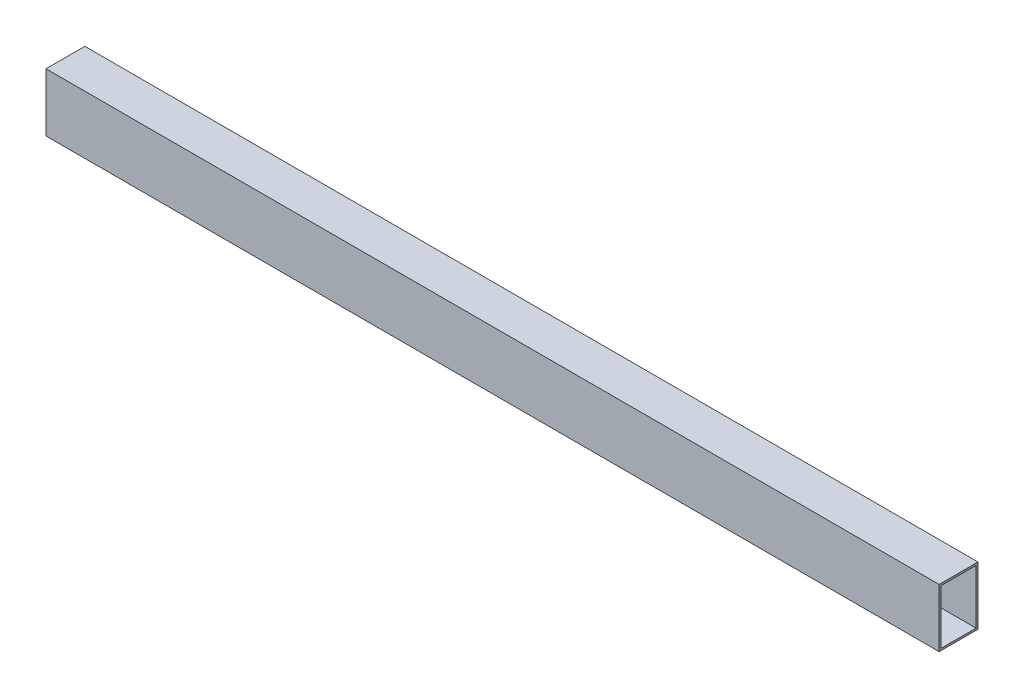
ISO-10303-21;
HEADER;
FILE_DESCRIPTION(('STEP AP214'),'2;1');
FILE_NAME('part.step','',(''),(''),'','','');
FILE_SCHEMA(('AUTOMOTIVE_DESIGN { 1 0 10303 214 1 1 1 1 }'));
ENDSEC;
DATA;
#1=APPLICATION_CONTEXT('core data for automotive mechanical design processes');
#2=APPLICATION_PROTOCOL_DEFINITION('international standard','automotive_design',2000,#1);
#3=PRODUCT_CONTEXT('',#1,'mechanical');
#4=PRODUCT('Part','Part','',(#3));
#5=PRODUCT_RELATED_PRODUCT_CATEGORY('part','',(#4));
#6=PRODUCT_DEFINITION_FORMATION('','',#4);
#7=PRODUCT_DEFINITION_CONTEXT('part definition',#1,'design');
#8=PRODUCT_DEFINITION('design','',#6,#7);
#9=PRODUCT_DEFINITION_SHAPE('','',#8);
#10=(LENGTH_UNIT() NAMED_UNIT(*) SI_UNIT(.MILLI.,.METRE.));
#11=(NAMED_UNIT(*) PLANE_ANGLE_UNIT() SI_UNIT($,.RADIAN.));
#12=(NAMED_UNIT(*) SI_UNIT($,.STERADIAN.) SOLID_ANGLE_UNIT());
#13=UNCERTAINTY_MEASURE_WITH_UNIT(LENGTH_MEASURE(1.E-05),#10,'distance_accuracy_value','');
#14=(GEOMETRIC_REPRESENTATION_CONTEXT(3) GLOBAL_UNCERTAINTY_ASSIGNED_CONTEXT((#13)) GLOBAL_UNIT_ASSIGNED_CONTEXT((#10,
#11,#12)) REPRESENTATION_CONTEXT('',''));
#15=CARTESIAN_POINT('',(0.,0.,0.));
#16=DIRECTION('',(0.,0.,1.));
#17=DIRECTION('',(1.,0.,0.));
#18=AXIS2_PLACEMENT_3D('',#15,#16,#17);
#19=CARTESIAN_POINT('',(460.,-14.,-9.));
#20=DIRECTION('',(0.,0.,1.));
#21=DIRECTION('',(1.,0.,0.));
#22=AXIS2_PLACEMENT_3D('',#19,#20,#21);
#23=PLANE('',#22);
#24=DIRECTION('',(0.,1.,0.));
#25=VECTOR('',#24,1.);
#26=CARTESIAN_POINT('',(0.,-14.,-9.));
#27=LINE('',#26,#25);
#28=CARTESIAN_POINT('',(0.,-14.,-9.));
#29=VERTEX_POINT('',#28);
#30=CARTESIAN_POINT('',(0.,14.,-9.));
#31=VERTEX_POINT('',#30);
#32=EDGE_CURVE('E157',#29,#31,#27,.T.);
#33=ORIENTED_EDGE('',*,*,#32,.F.);
#34=DIRECTION('',(-1.,0.,0.));
#35=VECTOR('',#34,1.);
#36=CARTESIAN_POINT('',(460.,-14.,-9.));
#37=LINE('',#36,#35);
#38=CARTESIAN_POINT('',(460.,-14.,-9.));
#39=VERTEX_POINT('',#38);
#40=EDGE_CURVE('E12',#39,#29,#37,.T.);
#41=ORIENTED_EDGE('',*,*,#40,.F.);
#42=DIRECTION('',(0.,1.,0.));
#43=VECTOR('',#42,1.);
#44=CARTESIAN_POINT('',(460.,-14.,-9.));
#45=LINE('',#44,#43);
#46=CARTESIAN_POINT('',(460.,14.,-9.));
#47=VERTEX_POINT('',#46);
#48=EDGE_CURVE('E139',#39,#47,#45,.T.);
#49=ORIENTED_EDGE('',*,*,#48,.T.);
#50=DIRECTION('',(-1.,0.,0.));
#51=VECTOR('',#50,1.);
#52=CARTESIAN_POINT('',(460.,14.,-9.));
#53=LINE('',#52,#51);
#54=EDGE_CURVE('E70',#47,#31,#53,.T.);
#55=ORIENTED_EDGE('',*,*,#54,.T.);
#56=EDGE_LOOP('',(#33,#41,#49,#55));
#57=FACE_BOUND('',#56,.T.);
#58=ADVANCED_FACE('F51',(#57),#23,.T.);
#59=CARTESIAN_POINT('',(460.,-14.,9.));
#60=DIRECTION('',(0.,1.,0.));
#61=DIRECTION('',(0.,0.,1.));
#62=AXIS2_PLACEMENT_3D('',#59,#60,#61);
#63=PLANE('',#62);
#64=DIRECTION('',(0.,0.,-1.));
#65=VECTOR('',#64,1.);
#66=CARTESIAN_POINT('',(0.,-14.,9.));
#67=LINE('',#66,#65);
#68=CARTESIAN_POINT('',(0.,-14.,9.));
#69=VERTEX_POINT('',#68);
#70=EDGE_CURVE('E128',#69,#29,#67,.T.);
#71=ORIENTED_EDGE('',*,*,#70,.F.);
#72=DIRECTION('',(-1.,0.,0.));
#73=VECTOR('',#72,1.);
#74=CARTESIAN_POINT('',(460.,-14.,9.));
#75=LINE('',#74,#73);
#76=CARTESIAN_POINT('',(460.,-14.,9.));
#77=VERTEX_POINT('',#76);
#78=EDGE_CURVE('E61',#77,#69,#75,.T.);
#79=ORIENTED_EDGE('',*,*,#78,.F.);
#80=DIRECTION('',(0.,0.,-1.));
#81=VECTOR('',#80,1.);
#82=CARTESIAN_POINT('',(460.,-14.,9.));
#83=LINE('',#82,#81);
#84=EDGE_CURVE('E126',#77,#39,#83,.T.);
#85=ORIENTED_EDGE('',*,*,#84,.T.);
#86=ORIENTED_EDGE('',*,*,#40,.T.);
#87=EDGE_LOOP('',(#71,#79,#85,#86));
#88=FACE_BOUND('',#87,.T.);
#89=ADVANCED_FACE('F125',(#88),#63,.T.);
#90=CARTESIAN_POINT('',(460.,-14.,9.));
#91=DIRECTION('',(0.,0.,-1.));
#92=DIRECTION('',(-1.,0.,0.));
#93=AXIS2_PLACEMENT_3D('',#90,#91,#92);
#94=PLANE('',#93);
#95=DIRECTION('',(0.,-1.,0.));
#96=VECTOR('',#95,1.);
#97=CARTESIAN_POINT('',(0.,-14.,9.));
#98=LINE('',#97,#96);
#99=CARTESIAN_POINT('',(0.,14.,9.));
#100=VERTEX_POINT('',#99);
#101=EDGE_CURVE('E160',#100,#69,#98,.T.);
#102=ORIENTED_EDGE('',*,*,#101,.F.);
#103=DIRECTION('',(-1.,0.,0.));
#104=VECTOR('',#103,1.);
#105=CARTESIAN_POINT('',(460.,14.,9.));
#106=LINE('',#105,#104);
#107=CARTESIAN_POINT('',(460.,14.,9.));
#108=VERTEX_POINT('',#107);
#109=EDGE_CURVE('E95',#108,#100,#106,.T.);
#110=ORIENTED_EDGE('',*,*,#109,.F.);
#111=DIRECTION('',(0.,-1.,0.));
#112=VECTOR('',#111,1.);
#113=CARTESIAN_POINT('',(460.,-14.,9.));
#114=LINE('',#113,#112);
#115=EDGE_CURVE('E138',#108,#77,#114,.T.);
#116=ORIENTED_EDGE('',*,*,#115,.T.);
#117=ORIENTED_EDGE('',*,*,#78,.T.);
#118=EDGE_LOOP('',(#102,#110,#116,#117));
#119=FACE_BOUND('',#118,.T.);
#120=ADVANCED_FACE('F141',(#119),#94,.T.);
#121=CARTESIAN_POINT('',(460.,-15.,-10.));
#122=DIRECTION('',(0.,0.,1.));
#123=DIRECTION('',(1.,0.,0.));
#124=AXIS2_PLACEMENT_3D('',#121,#122,#123);
#125=PLANE('',#124);
#126=DIRECTION('',(0.,1.,0.));
#127=VECTOR('',#126,1.);
#128=CARTESIAN_POINT('',(0.,-15.,-10.));
#129=LINE('',#128,#127);
#130=CARTESIAN_POINT('',(0.,-15.,-10.));
#131=VERTEX_POINT('',#130);
#132=CARTESIAN_POINT('',(0.,15.,-10.));
#133=VERTEX_POINT('',#132);
#134=EDGE_CURVE('E148',#131,#133,#129,.T.);
#135=ORIENTED_EDGE('',*,*,#134,.T.);
#136=DIRECTION('',(-1.,0.,0.));
#137=VECTOR('',#136,1.);
#138=CARTESIAN_POINT('',(460.,15.,-10.));
#139=LINE('',#138,#137);
#140=CARTESIAN_POINT('',(460.,15.,-10.));
#141=VERTEX_POINT('',#140);
#142=EDGE_CURVE('E55',#141,#133,#139,.T.);
#143=ORIENTED_EDGE('',*,*,#142,.F.);
#144=DIRECTION('',(0.,1.,0.));
#145=VECTOR('',#144,1.);
#146=CARTESIAN_POINT('',(460.,-15.,-10.));
#147=LINE('',#146,#145);
#148=CARTESIAN_POINT('',(460.,-15.,-10.));
#149=VERTEX_POINT('',#148);
#150=EDGE_CURVE('E165',#149,#141,#147,.T.);
#151=ORIENTED_EDGE('',*,*,#150,.F.);
#152=DIRECTION('',(-1.,0.,0.));
#153=VECTOR('',#152,1.);
#154=CARTESIAN_POINT('',(460.,-15.,-10.));
#155=LINE('',#154,#153);
#156=EDGE_CURVE('E144',#149,#131,#155,.T.);
#157=ORIENTED_EDGE('',*,*,#156,.T.);
#158=EDGE_LOOP('',(#135,#143,#151,#157));
#159=FACE_BOUND('',#158,.T.);
#160=ADVANCED_FACE('F53',(#159),#125,.F.);
#161=CARTESIAN_POINT('',(460.,15.,10.));
#162=DIRECTION('',(0.,-1.,0.));
#163=DIRECTION('',(0.,0.,-1.));
#164=AXIS2_PLACEMENT_3D('',#161,#162,#163);
#165=PLANE('',#164);
#166=DIRECTION('',(0.,0.,1.));
#167=VECTOR('',#166,1.);
#168=CARTESIAN_POINT('',(0.,15.,10.));
#169=LINE('',#168,#167);
#170=CARTESIAN_POINT('',(0.,15.,10.));
#171=VERTEX_POINT('',#170);
#172=EDGE_CURVE('E151',#133,#171,#169,.T.);
#173=ORIENTED_EDGE('',*,*,#172,.T.);
#174=DIRECTION('',(-1.,0.,0.));
#175=VECTOR('',#174,1.);
#176=CARTESIAN_POINT('',(460.,15.,10.));
#177=LINE('',#176,#175);
#178=CARTESIAN_POINT('',(460.,15.,10.));
#179=VERTEX_POINT('',#178);
#180=EDGE_CURVE('E172',#179,#171,#177,.T.);
#181=ORIENTED_EDGE('',*,*,#180,.F.);
#182=DIRECTION('',(0.,0.,1.));
#183=VECTOR('',#182,1.);
#184=CARTESIAN_POINT('',(460.,15.,10.));
#185=LINE('',#184,#183);
#186=EDGE_CURVE('E108',#141,#179,#185,.T.);
#187=ORIENTED_EDGE('',*,*,#186,.F.);
#188=ORIENTED_EDGE('',*,*,#142,.T.);
#189=EDGE_LOOP('',(#173,#181,#187,#188));
#190=FACE_BOUND('',#189,.T.);
#191=ADVANCED_FACE('F178',(#190),#165,.F.);
#192=CARTESIAN_POINT('',(460.,-15.,10.));
#193=DIRECTION('',(0.,0.,-1.));
#194=DIRECTION('',(-1.,0.,0.));
#195=AXIS2_PLACEMENT_3D('',#192,#193,#194);
#196=PLANE('',#195);
#197=DIRECTION('',(0.,-1.,0.));
#198=VECTOR('',#197,1.);
#199=CARTESIAN_POINT('',(0.,-15.,10.));
#200=LINE('',#199,#198);
#201=CARTESIAN_POINT('',(0.,-15.,10.));
#202=VERTEX_POINT('',#201);
#203=EDGE_CURVE('E153',#171,#202,#200,.T.);
#204=ORIENTED_EDGE('',*,*,#203,.T.);
#205=DIRECTION('',(-1.,0.,0.));
#206=VECTOR('',#205,1.);
#207=CARTESIAN_POINT('',(460.,-15.,10.));
#208=LINE('',#207,#206);
#209=CARTESIAN_POINT('',(460.,-15.,10.));
#210=VERTEX_POINT('',#209);
#211=EDGE_CURVE('E170',#210,#202,#208,.T.);
#212=ORIENTED_EDGE('',*,*,#211,.F.);
#213=DIRECTION('',(0.,-1.,0.));
#214=VECTOR('',#213,1.);
#215=CARTESIAN_POINT('',(460.,-15.,10.));
#216=LINE('',#215,#214);
#217=EDGE_CURVE('E194',#179,#210,#216,.T.);
#218=ORIENTED_EDGE('',*,*,#217,.F.);
#219=ORIENTED_EDGE('',*,*,#180,.T.);
#220=EDGE_LOOP('',(#204,#212,#218,#219));
#221=FACE_BOUND('',#220,.T.);
#222=ADVANCED_FACE('F188',(#221),#196,.F.);
#223=CARTESIAN_POINT('',(460.,-15.,10.));
#224=DIRECTION('',(0.,1.,0.));
#225=DIRECTION('',(0.,0.,1.));
#226=AXIS2_PLACEMENT_3D('',#223,#224,#225);
#227=PLANE('',#226);
#228=DIRECTION('',(0.,0.,-1.));
#229=VECTOR('',#228,1.);
#230=CARTESIAN_POINT('',(0.,-15.,10.));
#231=LINE('',#230,#229);
#232=EDGE_CURVE('E155',#202,#131,#231,.T.);
#233=ORIENTED_EDGE('',*,*,#232,.T.);
#234=ORIENTED_EDGE('',*,*,#156,.F.);
#235=DIRECTION('',(0.,0.,-1.));
#236=VECTOR('',#235,1.);
#237=CARTESIAN_POINT('',(460.,-15.,10.));
#238=LINE('',#237,#236);
#239=EDGE_CURVE('E192',#210,#149,#238,.T.);
#240=ORIENTED_EDGE('',*,*,#239,.F.);
#241=ORIENTED_EDGE('',*,*,#211,.T.);
#242=EDGE_LOOP('',(#233,#234,#240,#241));
#243=FACE_BOUND('',#242,.T.);
#244=ADVANCED_FACE('F191',(#243),#227,.F.);
#245=CARTESIAN_POINT('',(460.,14.,9.));
#246=DIRECTION('',(0.,-1.,0.));
#247=DIRECTION('',(0.,0.,-1.));
#248=AXIS2_PLACEMENT_3D('',#245,#246,#247);
#249=PLANE('',#248);
#250=DIRECTION('',(0.,0.,1.));
#251=VECTOR('',#250,1.);
#252=CARTESIAN_POINT('',(0.,14.,9.));
#253=LINE('',#252,#251);
#254=EDGE_CURVE('E162',#31,#100,#253,.T.);
#255=ORIENTED_EDGE('',*,*,#254,.F.);
#256=ORIENTED_EDGE('',*,*,#54,.F.);
#257=DIRECTION('',(0.,0.,1.));
#258=VECTOR('',#257,1.);
#259=CARTESIAN_POINT('',(460.,14.,9.));
#260=LINE('',#259,#258);
#261=EDGE_CURVE('E142',#47,#108,#260,.T.);
#262=ORIENTED_EDGE('',*,*,#261,.T.);
#263=ORIENTED_EDGE('',*,*,#109,.T.);
#264=EDGE_LOOP('',(#255,#256,#262,#263));
#265=FACE_BOUND('',#264,.T.);
#266=ADVANCED_FACE('F200',(#265),#249,.T.);
#267=CARTESIAN_POINT('',(460.,0.,0.));
#268=DIRECTION('',(-1.,0.,0.));
#269=DIRECTION('',(0.,0.,1.));
#270=AXIS2_PLACEMENT_3D('',#267,#268,#269);
#271=PLANE('',#270);
#272=ORIENTED_EDGE('',*,*,#150,.T.);
#273=ORIENTED_EDGE('',*,*,#186,.T.);
#274=ORIENTED_EDGE('',*,*,#217,.T.);
#275=ORIENTED_EDGE('',*,*,#239,.T.);
#276=EDGE_LOOP('',(#272,#273,#274,#275));
#277=FACE_BOUND('',#276,.T.);
#278=ORIENTED_EDGE('',*,*,#48,.F.);
#279=ORIENTED_EDGE('',*,*,#84,.F.);
#280=ORIENTED_EDGE('',*,*,#115,.F.);
#281=ORIENTED_EDGE('',*,*,#261,.F.);
#282=EDGE_LOOP('',(#278,#279,#280,#281));
#283=FACE_BOUND('',#282,.T.);
#284=ADVANCED_FACE('F136',(#277,#283),#271,.F.);
#285=CARTESIAN_POINT('',(0.,0.,0.));
#286=DIRECTION('',(-1.,0.,0.));
#287=DIRECTION('',(0.,0.,1.));
#288=AXIS2_PLACEMENT_3D('',#285,#286,#287);
#289=PLANE('',#288);
#290=ORIENTED_EDGE('',*,*,#134,.F.);
#291=ORIENTED_EDGE('',*,*,#232,.F.);
#292=ORIENTED_EDGE('',*,*,#203,.F.);
#293=ORIENTED_EDGE('',*,*,#172,.F.);
#294=EDGE_LOOP('',(#290,#291,#292,#293));
#295=FACE_BOUND('',#294,.T.);
#296=ORIENTED_EDGE('',*,*,#32,.T.);
#297=ORIENTED_EDGE('',*,*,#254,.T.);
#298=ORIENTED_EDGE('',*,*,#101,.T.);
#299=ORIENTED_EDGE('',*,*,#70,.T.);
#300=EDGE_LOOP('',(#296,#297,#298,#299));
#301=FACE_BOUND('',#300,.T.);
#302=ADVANCED_FACE('F185',(#295,#301),#289,.T.);
#303=CLOSED_SHELL('',(#58,#89,#120,#160,#191,#222,#244,#266,#284,#302));
#304=MANIFOLD_SOLID_BREP('B2',#303);
#305=ADVANCED_BREP_SHAPE_REPRESENTATION('',(#18,#304),#14);
#306=SHAPE_DEFINITION_REPRESENTATION(#9,#305);
ENDSEC;
END-ISO-10303-21;
